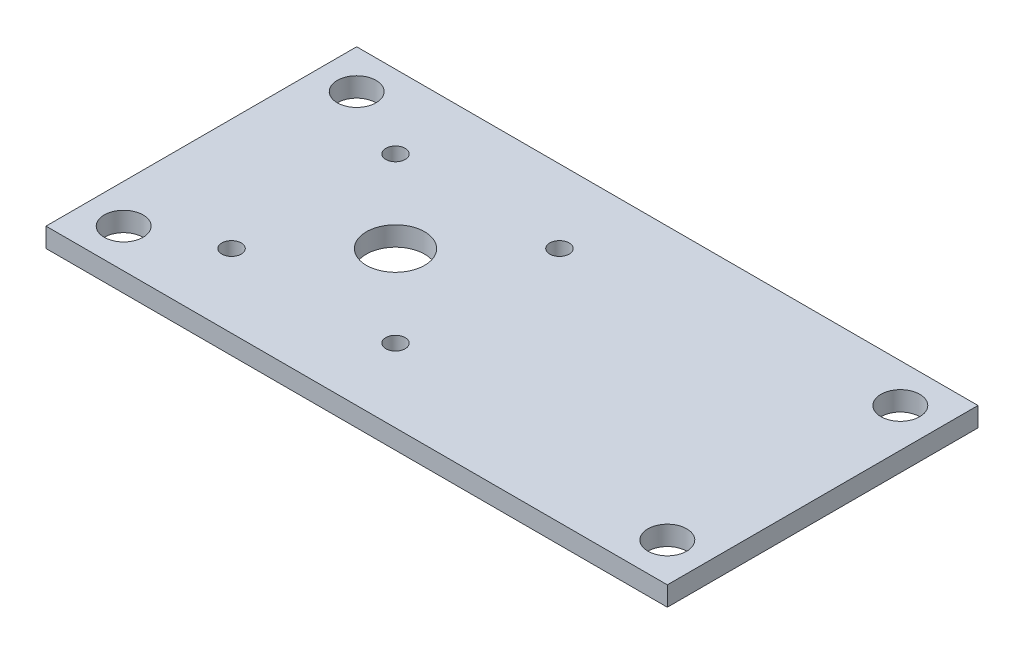
ISO-10303-21;
HEADER;
FILE_DESCRIPTION(('STEP AP214'),'2;1');
FILE_NAME('part.step','',(''),(''),'','','');
FILE_SCHEMA(('AUTOMOTIVE_DESIGN { 1 0 10303 214 1 1 1 1 }'));
ENDSEC;
DATA;
#1=APPLICATION_CONTEXT('core data for automotive mechanical design processes');
#2=APPLICATION_PROTOCOL_DEFINITION('international standard','automotive_design',2000,#1);
#3=PRODUCT_CONTEXT('',#1,'mechanical');
#4=PRODUCT('Part','Part','',(#3));
#5=PRODUCT_RELATED_PRODUCT_CATEGORY('part','',(#4));
#6=PRODUCT_DEFINITION_FORMATION('','',#4);
#7=PRODUCT_DEFINITION_CONTEXT('part definition',#1,'design');
#8=PRODUCT_DEFINITION('design','',#6,#7);
#9=PRODUCT_DEFINITION_SHAPE('','',#8);
#10=(LENGTH_UNIT() NAMED_UNIT(*) SI_UNIT(.MILLI.,.METRE.));
#11=(NAMED_UNIT(*) PLANE_ANGLE_UNIT() SI_UNIT($,.RADIAN.));
#12=(NAMED_UNIT(*) SI_UNIT($,.STERADIAN.) SOLID_ANGLE_UNIT());
#13=UNCERTAINTY_MEASURE_WITH_UNIT(LENGTH_MEASURE(1.E-05),#10,'distance_accuracy_value','');
#14=(GEOMETRIC_REPRESENTATION_CONTEXT(3) GLOBAL_UNCERTAINTY_ASSIGNED_CONTEXT((#13)) GLOBAL_UNIT_ASSIGNED_CONTEXT((#10,
#11,#12)) REPRESENTATION_CONTEXT('',''));
#15=CARTESIAN_POINT('',(0.,0.,0.));
#16=DIRECTION('',(0.,0.,1.));
#17=DIRECTION('',(1.,0.,0.));
#18=AXIS2_PLACEMENT_3D('',#15,#16,#17);
#19=CARTESIAN_POINT('',(0.,6.35,0.));
#20=DIRECTION('',(1.,0.,0.));
#21=DIRECTION('',(0.,0.,-1.));
#22=AXIS2_PLACEMENT_3D('',#19,#20,#21);
#23=PLANE('',#22);
#24=DIRECTION('',(0.,0.,1.));
#25=VECTOR('',#24,1.);
#26=CARTESIAN_POINT('',(0.,0.,0.));
#27=LINE('',#26,#25);
#28=CARTESIAN_POINT('',(0.,0.,-101.6));
#29=VERTEX_POINT('',#28);
#30=CARTESIAN_POINT('',(0.,0.,0.));
#31=VERTEX_POINT('',#30);
#32=EDGE_CURVE('E95',#29,#31,#27,.T.);
#33=ORIENTED_EDGE('',*,*,#32,.T.);
#34=DIRECTION('',(0.,-1.,0.));
#35=VECTOR('',#34,1.);
#36=CARTESIAN_POINT('',(0.,6.35,0.));
#37=LINE('',#36,#35);
#38=CARTESIAN_POINT('',(0.,6.35,0.));
#39=VERTEX_POINT('',#38);
#40=EDGE_CURVE('E11',#39,#31,#37,.T.);
#41=ORIENTED_EDGE('',*,*,#40,.F.);
#42=DIRECTION('',(0.,0.,1.));
#43=VECTOR('',#42,1.);
#44=CARTESIAN_POINT('',(0.,6.35,0.));
#45=LINE('',#44,#43);
#46=CARTESIAN_POINT('',(0.,6.35,-101.6));
#47=VERTEX_POINT('',#46);
#48=EDGE_CURVE('E83',#47,#39,#45,.T.);
#49=ORIENTED_EDGE('',*,*,#48,.F.);
#50=DIRECTION('',(0.,-1.,0.));
#51=VECTOR('',#50,1.);
#52=CARTESIAN_POINT('',(0.,6.35,-101.6));
#53=LINE('',#52,#51);
#54=EDGE_CURVE('E91',#47,#29,#53,.T.);
#55=ORIENTED_EDGE('',*,*,#54,.T.);
#56=EDGE_LOOP('',(#33,#41,#49,#55));
#57=FACE_BOUND('',#56,.T.);
#58=ADVANCED_FACE('F32',(#57),#23,.F.);
#59=CARTESIAN_POINT('',(0.,6.35,0.));
#60=DIRECTION('',(0.,0.,-1.));
#61=DIRECTION('',(-1.,0.,0.));
#62=AXIS2_PLACEMENT_3D('',#59,#60,#61);
#63=PLANE('',#62);
#64=DIRECTION('',(1.,0.,0.));
#65=VECTOR('',#64,1.);
#66=CARTESIAN_POINT('',(0.,0.,0.));
#67=LINE('',#66,#65);
#68=CARTESIAN_POINT('',(203.2,0.,0.));
#69=VERTEX_POINT('',#68);
#70=EDGE_CURVE('E87',#31,#69,#67,.T.);
#71=ORIENTED_EDGE('',*,*,#70,.T.);
#72=DIRECTION('',(0.,-1.,0.));
#73=VECTOR('',#72,1.);
#74=CARTESIAN_POINT('',(203.2,6.35,0.));
#75=LINE('',#74,#73);
#76=CARTESIAN_POINT('',(203.2,6.35,0.));
#77=VERTEX_POINT('',#76);
#78=EDGE_CURVE('E40',#77,#69,#75,.T.);
#79=ORIENTED_EDGE('',*,*,#78,.F.);
#80=DIRECTION('',(1.,0.,0.));
#81=VECTOR('',#80,1.);
#82=CARTESIAN_POINT('',(0.,6.35,0.));
#83=LINE('',#82,#81);
#84=EDGE_CURVE('E78',#39,#77,#83,.T.);
#85=ORIENTED_EDGE('',*,*,#84,.F.);
#86=ORIENTED_EDGE('',*,*,#40,.T.);
#87=EDGE_LOOP('',(#71,#79,#85,#86));
#88=FACE_BOUND('',#87,.T.);
#89=ADVANCED_FACE('F86',(#88),#63,.F.);
#90=CARTESIAN_POINT('',(203.2,6.35,0.));
#91=DIRECTION('',(-1.,0.,0.));
#92=DIRECTION('',(0.,0.,1.));
#93=AXIS2_PLACEMENT_3D('',#90,#91,#92);
#94=PLANE('',#93);
#95=DIRECTION('',(0.,0.,-1.));
#96=VECTOR('',#95,1.);
#97=CARTESIAN_POINT('',(203.2,0.,0.));
#98=LINE('',#97,#96);
#99=CARTESIAN_POINT('',(203.2,0.,-101.6));
#100=VERTEX_POINT('',#99);
#101=EDGE_CURVE('E65',#69,#100,#98,.T.);
#102=ORIENTED_EDGE('',*,*,#101,.T.);
#103=DIRECTION('',(0.,-1.,0.));
#104=VECTOR('',#103,1.);
#105=CARTESIAN_POINT('',(203.2,6.35,-101.6));
#106=LINE('',#105,#104);
#107=CARTESIAN_POINT('',(203.2,6.35,-101.6));
#108=VERTEX_POINT('',#107);
#109=EDGE_CURVE('E88',#108,#100,#106,.T.);
#110=ORIENTED_EDGE('',*,*,#109,.F.);
#111=DIRECTION('',(0.,0.,-1.));
#112=VECTOR('',#111,1.);
#113=CARTESIAN_POINT('',(203.2,6.35,0.));
#114=LINE('',#113,#112);
#115=EDGE_CURVE('E81',#77,#108,#114,.T.);
#116=ORIENTED_EDGE('',*,*,#115,.F.);
#117=ORIENTED_EDGE('',*,*,#78,.T.);
#118=EDGE_LOOP('',(#102,#110,#116,#117));
#119=FACE_BOUND('',#118,.T.);
#120=ADVANCED_FACE('F89',(#119),#94,.F.);
#121=CARTESIAN_POINT('',(0.,6.35,-101.6));
#122=DIRECTION('',(0.,0.,1.));
#123=DIRECTION('',(1.,0.,0.));
#124=AXIS2_PLACEMENT_3D('',#121,#122,#123);
#125=PLANE('',#124);
#126=DIRECTION('',(-1.,0.,0.));
#127=VECTOR('',#126,1.);
#128=CARTESIAN_POINT('',(0.,0.,-101.6));
#129=LINE('',#128,#127);
#130=EDGE_CURVE('E71',#100,#29,#129,.T.);
#131=ORIENTED_EDGE('',*,*,#130,.T.);
#132=ORIENTED_EDGE('',*,*,#54,.F.);
#133=DIRECTION('',(-1.,0.,0.));
#134=VECTOR('',#133,1.);
#135=CARTESIAN_POINT('',(0.,6.35,-101.6));
#136=LINE('',#135,#134);
#137=EDGE_CURVE('E48',#108,#47,#136,.T.);
#138=ORIENTED_EDGE('',*,*,#137,.F.);
#139=ORIENTED_EDGE('',*,*,#109,.T.);
#140=EDGE_LOOP('',(#131,#132,#138,#139));
#141=FACE_BOUND('',#140,.T.);
#142=ADVANCED_FACE('F103',(#141),#125,.F.);
#143=CARTESIAN_POINT('',(0.,6.35,0.));
#144=DIRECTION('',(0.,-1.,0.));
#145=DIRECTION('',(0.,0.,-1.));
#146=AXIS2_PLACEMENT_3D('',#143,#144,#145);
#147=PLANE('',#146);
#148=CARTESIAN_POINT('',(90.306064521391,6.35,-77.6060645213918));
#149=DIRECTION('',(0.,1.,0.));
#150=DIRECTION('',(-1.,0.,0.));
#151=AXIS2_PLACEMENT_3D('',#148,#149,#150);
#152=CIRCLE('',#151,3.17499999999999);
#153=CARTESIAN_POINT('',(87.131064521391,6.35,-77.6060645213918));
#154=VERTEX_POINT('',#153);
#155=EDGE_CURVE('E157',#154,#154,#152,.T.);
#156=ORIENTED_EDGE('',*,*,#155,.F.);
#157=EDGE_LOOP('',(#156));
#158=FACE_BOUND('',#157,.T.);
#159=CARTESIAN_POINT('',(90.3060645213916,6.35,-23.9939354786087));
#160=DIRECTION('',(0.,1.,0.));
#161=DIRECTION('',(0.,0.,-1.));
#162=AXIS2_PLACEMENT_3D('',#159,#160,#161);
#163=CIRCLE('',#162,3.17499999999999);
#164=CARTESIAN_POINT('',(90.3060645213916,6.35,-27.1689354786087));
#165=VERTEX_POINT('',#164);
#166=EDGE_CURVE('E151',#165,#165,#163,.T.);
#167=ORIENTED_EDGE('',*,*,#166,.F.);
#168=EDGE_LOOP('',(#167));
#169=FACE_BOUND('',#168,.T.);
#170=CARTESIAN_POINT('',(36.6939354786088,6.35,-23.9939354786083));
#171=DIRECTION('',(0.,1.,0.));
#172=DIRECTION('',(1.,0.,0.));
#173=AXIS2_PLACEMENT_3D('',#170,#171,#172);
#174=CIRCLE('',#173,3.17499999999999);
#175=CARTESIAN_POINT('',(39.8689354786088,6.35,-23.9939354786083));
#176=VERTEX_POINT('',#175);
#177=EDGE_CURVE('E145',#176,#176,#174,.T.);
#178=ORIENTED_EDGE('',*,*,#177,.F.);
#179=EDGE_LOOP('',(#178));
#180=FACE_BOUND('',#179,.T.);
#181=CARTESIAN_POINT('',(36.6939354786084,6.35,-77.6060645213913));
#182=DIRECTION('',(0.,1.,0.));
#183=DIRECTION('',(0.,0.,1.));
#184=AXIS2_PLACEMENT_3D('',#181,#182,#183);
#185=CIRCLE('',#184,3.17499999999999);
#186=CARTESIAN_POINT('',(36.6939354786084,6.35,-74.4310645213913));
#187=VERTEX_POINT('',#186);
#188=EDGE_CURVE('E139',#187,#187,#185,.T.);
#189=ORIENTED_EDGE('',*,*,#188,.F.);
#190=EDGE_LOOP('',(#189));
#191=FACE_BOUND('',#190,.T.);
#192=CARTESIAN_POINT('',(190.5,6.35,-88.9));
#193=DIRECTION('',(0.,-1.,0.));
#194=DIRECTION('',(0.,0.,1.));
#195=AXIS2_PLACEMENT_3D('',#192,#193,#194);
#196=CIRCLE('',#195,6.35);
#197=CARTESIAN_POINT('',(190.5,6.35,-82.55));
#198=VERTEX_POINT('',#197);
#199=EDGE_CURVE('E133',#198,#198,#196,.T.);
#200=ORIENTED_EDGE('',*,*,#199,.T.);
#201=EDGE_LOOP('',(#200));
#202=FACE_BOUND('',#201,.T.);
#203=CARTESIAN_POINT('',(190.5,6.35,-12.7));
#204=DIRECTION('',(0.,1.,0.));
#205=DIRECTION('',(0.,0.,-1.));
#206=AXIS2_PLACEMENT_3D('',#203,#204,#205);
#207=CIRCLE('',#206,6.35);
#208=CARTESIAN_POINT('',(190.5,6.35,-19.05));
#209=VERTEX_POINT('',#208);
#210=EDGE_CURVE('E127',#209,#209,#207,.T.);
#211=ORIENTED_EDGE('',*,*,#210,.F.);
#212=EDGE_LOOP('',(#211));
#213=FACE_BOUND('',#212,.T.);
#214=CARTESIAN_POINT('',(12.7,6.35,-12.7));
#215=DIRECTION('',(0.,-1.,0.));
#216=DIRECTION('',(0.,0.,-1.));
#217=AXIS2_PLACEMENT_3D('',#214,#215,#216);
#218=CIRCLE('',#217,6.35);
#219=CARTESIAN_POINT('',(12.7,6.35,-19.05));
#220=VERTEX_POINT('',#219);
#221=EDGE_CURVE('E121',#220,#220,#218,.T.);
#222=ORIENTED_EDGE('',*,*,#221,.T.);
#223=EDGE_LOOP('',(#222));
#224=FACE_BOUND('',#223,.T.);
#225=CARTESIAN_POINT('',(12.7,6.35,-88.9));
#226=DIRECTION('',(0.,1.,0.));
#227=DIRECTION('',(0.,0.,1.));
#228=AXIS2_PLACEMENT_3D('',#225,#226,#227);
#229=CIRCLE('',#228,6.35);
#230=CARTESIAN_POINT('',(12.7,6.35,-82.55));
#231=VERTEX_POINT('',#230);
#232=EDGE_CURVE('E115',#231,#231,#229,.T.);
#233=ORIENTED_EDGE('',*,*,#232,.F.);
#234=EDGE_LOOP('',(#233));
#235=FACE_BOUND('',#234,.T.);
#236=CARTESIAN_POINT('',(63.5,6.35,-50.8));
#237=DIRECTION('',(0.,1.,0.));
#238=DIRECTION('',(0.,0.,1.));
#239=AXIS2_PLACEMENT_3D('',#236,#237,#238);
#240=CIRCLE('',#239,9.52500000000002);
#241=CARTESIAN_POINT('',(63.5,6.35,-41.275));
#242=VERTEX_POINT('',#241);
#243=EDGE_CURVE('E109',#242,#242,#240,.T.);
#244=ORIENTED_EDGE('',*,*,#243,.F.);
#245=EDGE_LOOP('',(#244));
#246=FACE_BOUND('',#245,.T.);
#247=ORIENTED_EDGE('',*,*,#48,.T.);
#248=ORIENTED_EDGE('',*,*,#84,.T.);
#249=ORIENTED_EDGE('',*,*,#115,.T.);
#250=ORIENTED_EDGE('',*,*,#137,.T.);
#251=EDGE_LOOP('',(#247,#248,#249,#250));
#252=FACE_BOUND('',#251,.T.);
#253=ADVANCED_FACE('F79',(#158,#169,#180,#191,#202,#213,#224,#235,#246,#252),#147,.F.);
#254=CARTESIAN_POINT('',(0.,0.,0.));
#255=DIRECTION('',(0.,-1.,0.));
#256=DIRECTION('',(0.,0.,-1.));
#257=AXIS2_PLACEMENT_3D('',#254,#255,#256);
#258=PLANE('',#257);
#259=CARTESIAN_POINT('',(90.306064521391,0.,-77.6060645213918));
#260=DIRECTION('',(0.,1.,0.));
#261=DIRECTION('',(-1.,0.,0.));
#262=AXIS2_PLACEMENT_3D('',#259,#260,#261);
#263=CIRCLE('',#262,3.17499999999999);
#264=CARTESIAN_POINT('',(87.131064521391,0.,-77.6060645213918));
#265=VERTEX_POINT('',#264);
#266=EDGE_CURVE('E154',#265,#265,#263,.T.);
#267=ORIENTED_EDGE('',*,*,#266,.T.);
#268=EDGE_LOOP('',(#267));
#269=FACE_BOUND('',#268,.T.);
#270=CARTESIAN_POINT('',(90.3060645213916,0.,-23.9939354786087));
#271=DIRECTION('',(0.,1.,0.));
#272=DIRECTION('',(0.,0.,-1.));
#273=AXIS2_PLACEMENT_3D('',#270,#271,#272);
#274=CIRCLE('',#273,3.17499999999999);
#275=CARTESIAN_POINT('',(90.3060645213916,0.,-27.1689354786087));
#276=VERTEX_POINT('',#275);
#277=EDGE_CURVE('E148',#276,#276,#274,.T.);
#278=ORIENTED_EDGE('',*,*,#277,.T.);
#279=EDGE_LOOP('',(#278));
#280=FACE_BOUND('',#279,.T.);
#281=CARTESIAN_POINT('',(36.6939354786088,0.,-23.9939354786083));
#282=DIRECTION('',(0.,1.,0.));
#283=DIRECTION('',(1.,0.,0.));
#284=AXIS2_PLACEMENT_3D('',#281,#282,#283);
#285=CIRCLE('',#284,3.17499999999999);
#286=CARTESIAN_POINT('',(39.8689354786088,0.,-23.9939354786083));
#287=VERTEX_POINT('',#286);
#288=EDGE_CURVE('E142',#287,#287,#285,.T.);
#289=ORIENTED_EDGE('',*,*,#288,.T.);
#290=EDGE_LOOP('',(#289));
#291=FACE_BOUND('',#290,.T.);
#292=CARTESIAN_POINT('',(36.6939354786084,0.,-77.6060645213913));
#293=DIRECTION('',(0.,1.,0.));
#294=DIRECTION('',(0.,0.,1.));
#295=AXIS2_PLACEMENT_3D('',#292,#293,#294);
#296=CIRCLE('',#295,3.17499999999999);
#297=CARTESIAN_POINT('',(36.6939354786084,0.,-74.4310645213913));
#298=VERTEX_POINT('',#297);
#299=EDGE_CURVE('E136',#298,#298,#296,.T.);
#300=ORIENTED_EDGE('',*,*,#299,.T.);
#301=EDGE_LOOP('',(#300));
#302=FACE_BOUND('',#301,.T.);
#303=CARTESIAN_POINT('',(190.5,0.,-88.9));
#304=DIRECTION('',(0.,-1.,0.));
#305=DIRECTION('',(0.,0.,1.));
#306=AXIS2_PLACEMENT_3D('',#303,#304,#305);
#307=CIRCLE('',#306,6.35);
#308=CARTESIAN_POINT('',(190.5,0.,-82.55));
#309=VERTEX_POINT('',#308);
#310=EDGE_CURVE('E130',#309,#309,#307,.T.);
#311=ORIENTED_EDGE('',*,*,#310,.F.);
#312=EDGE_LOOP('',(#311));
#313=FACE_BOUND('',#312,.T.);
#314=CARTESIAN_POINT('',(190.5,0.,-12.7));
#315=DIRECTION('',(0.,1.,0.));
#316=DIRECTION('',(0.,0.,-1.));
#317=AXIS2_PLACEMENT_3D('',#314,#315,#316);
#318=CIRCLE('',#317,6.35);
#319=CARTESIAN_POINT('',(190.5,0.,-19.05));
#320=VERTEX_POINT('',#319);
#321=EDGE_CURVE('E124',#320,#320,#318,.T.);
#322=ORIENTED_EDGE('',*,*,#321,.T.);
#323=EDGE_LOOP('',(#322));
#324=FACE_BOUND('',#323,.T.);
#325=CARTESIAN_POINT('',(12.7,0.,-12.7));
#326=DIRECTION('',(0.,-1.,0.));
#327=DIRECTION('',(0.,0.,-1.));
#328=AXIS2_PLACEMENT_3D('',#325,#326,#327);
#329=CIRCLE('',#328,6.35);
#330=CARTESIAN_POINT('',(12.7,0.,-19.05));
#331=VERTEX_POINT('',#330);
#332=EDGE_CURVE('E118',#331,#331,#329,.T.);
#333=ORIENTED_EDGE('',*,*,#332,.F.);
#334=EDGE_LOOP('',(#333));
#335=FACE_BOUND('',#334,.T.);
#336=CARTESIAN_POINT('',(12.7,0.,-88.9));
#337=DIRECTION('',(0.,1.,0.));
#338=DIRECTION('',(0.,0.,1.));
#339=AXIS2_PLACEMENT_3D('',#336,#337,#338);
#340=CIRCLE('',#339,6.35);
#341=CARTESIAN_POINT('',(12.7,0.,-82.55));
#342=VERTEX_POINT('',#341);
#343=EDGE_CURVE('E112',#342,#342,#340,.T.);
#344=ORIENTED_EDGE('',*,*,#343,.T.);
#345=EDGE_LOOP('',(#344));
#346=FACE_BOUND('',#345,.T.);
#347=CARTESIAN_POINT('',(63.5,0.,-50.8));
#348=DIRECTION('',(0.,1.,0.));
#349=DIRECTION('',(0.,0.,1.));
#350=AXIS2_PLACEMENT_3D('',#347,#348,#349);
#351=CIRCLE('',#350,9.52500000000002);
#352=CARTESIAN_POINT('',(63.5,0.,-41.275));
#353=VERTEX_POINT('',#352);
#354=EDGE_CURVE('E98',#353,#353,#351,.T.);
#355=ORIENTED_EDGE('',*,*,#354,.T.);
#356=EDGE_LOOP('',(#355));
#357=FACE_BOUND('',#356,.T.);
#358=ORIENTED_EDGE('',*,*,#32,.F.);
#359=ORIENTED_EDGE('',*,*,#130,.F.);
#360=ORIENTED_EDGE('',*,*,#101,.F.);
#361=ORIENTED_EDGE('',*,*,#70,.F.);
#362=EDGE_LOOP('',(#358,#359,#360,#361));
#363=FACE_BOUND('',#362,.T.);
#364=ADVANCED_FACE('F106',(#269,#280,#291,#302,#313,#324,#335,#346,#357,#363),#258,.T.);
#365=CARTESIAN_POINT('',(63.5,0.,-50.8));
#366=DIRECTION('',(0.,1.,0.));
#367=DIRECTION('',(0.,0.,1.));
#368=AXIS2_PLACEMENT_3D('',#365,#366,#367);
#369=CYLINDRICAL_SURFACE('',#368,9.52500000000002);
#370=ORIENTED_EDGE('',*,*,#354,.F.);
#371=EDGE_LOOP('',(#370));
#372=FACE_BOUND('',#371,.T.);
#373=ORIENTED_EDGE('',*,*,#243,.T.);
#374=EDGE_LOOP('',(#373));
#375=FACE_BOUND('',#374,.T.);
#376=ADVANCED_FACE('F191',(#372,#375),#369,.F.);
#377=CARTESIAN_POINT('',(12.7,0.,-88.9));
#378=DIRECTION('',(0.,1.,0.));
#379=DIRECTION('',(0.,0.,1.));
#380=AXIS2_PLACEMENT_3D('',#377,#378,#379);
#381=CYLINDRICAL_SURFACE('',#380,6.35);
#382=ORIENTED_EDGE('',*,*,#343,.F.);
#383=EDGE_LOOP('',(#382));
#384=FACE_BOUND('',#383,.T.);
#385=ORIENTED_EDGE('',*,*,#232,.T.);
#386=EDGE_LOOP('',(#385));
#387=FACE_BOUND('',#386,.T.);
#388=ADVANCED_FACE('F193',(#384,#387),#381,.F.);
#389=CARTESIAN_POINT('',(12.7,0.,-12.7));
#390=DIRECTION('',(0.,1.,0.));
#391=DIRECTION('',(0.,0.,1.));
#392=AXIS2_PLACEMENT_3D('',#389,#390,#391);
#393=CYLINDRICAL_SURFACE('',#392,6.35);
#394=ORIENTED_EDGE('',*,*,#332,.T.);
#395=EDGE_LOOP('',(#394));
#396=FACE_BOUND('',#395,.T.);
#397=ORIENTED_EDGE('',*,*,#221,.F.);
#398=EDGE_LOOP('',(#397));
#399=FACE_BOUND('',#398,.T.);
#400=ADVANCED_FACE('F200',(#396,#399),#393,.F.);
#401=CARTESIAN_POINT('',(190.5,0.,-12.7));
#402=DIRECTION('',(0.,1.,0.));
#403=DIRECTION('',(0.,0.,1.));
#404=AXIS2_PLACEMENT_3D('',#401,#402,#403);
#405=CYLINDRICAL_SURFACE('',#404,6.35);
#406=ORIENTED_EDGE('',*,*,#321,.F.);
#407=EDGE_LOOP('',(#406));
#408=FACE_BOUND('',#407,.T.);
#409=ORIENTED_EDGE('',*,*,#210,.T.);
#410=EDGE_LOOP('',(#409));
#411=FACE_BOUND('',#410,.T.);
#412=ADVANCED_FACE('F269',(#408,#411),#405,.F.);
#413=CARTESIAN_POINT('',(190.5,0.,-88.9));
#414=DIRECTION('',(0.,1.,0.));
#415=DIRECTION('',(0.,0.,1.));
#416=AXIS2_PLACEMENT_3D('',#413,#414,#415);
#417=CYLINDRICAL_SURFACE('',#416,6.35);
#418=ORIENTED_EDGE('',*,*,#310,.T.);
#419=EDGE_LOOP('',(#418));
#420=FACE_BOUND('',#419,.T.);
#421=ORIENTED_EDGE('',*,*,#199,.F.);
#422=EDGE_LOOP('',(#421));
#423=FACE_BOUND('',#422,.T.);
#424=ADVANCED_FACE('F265',(#420,#423),#417,.F.);
#425=CARTESIAN_POINT('',(36.6939354786084,0.,-77.6060645213913));
#426=DIRECTION('',(0.,1.,0.));
#427=DIRECTION('',(0.,0.,1.));
#428=AXIS2_PLACEMENT_3D('',#425,#426,#427);
#429=CYLINDRICAL_SURFACE('',#428,3.17499999999999);
#430=ORIENTED_EDGE('',*,*,#299,.F.);
#431=EDGE_LOOP('',(#430));
#432=FACE_BOUND('',#431,.T.);
#433=ORIENTED_EDGE('',*,*,#188,.T.);
#434=EDGE_LOOP('',(#433));
#435=FACE_BOUND('',#434,.T.);
#436=ADVANCED_FACE('F239',(#432,#435),#429,.F.);
#437=CARTESIAN_POINT('',(36.6939354786088,0.,-23.9939354786083));
#438=DIRECTION('',(0.,1.,0.));
#439=DIRECTION('',(0.,0.,1.));
#440=AXIS2_PLACEMENT_3D('',#437,#438,#439);
#441=CYLINDRICAL_SURFACE('',#440,3.17499999999999);
#442=ORIENTED_EDGE('',*,*,#288,.F.);
#443=EDGE_LOOP('',(#442));
#444=FACE_BOUND('',#443,.T.);
#445=ORIENTED_EDGE('',*,*,#177,.T.);
#446=EDGE_LOOP('',(#445));
#447=FACE_BOUND('',#446,.T.);
#448=ADVANCED_FACE('F234',(#444,#447),#441,.F.);
#449=CARTESIAN_POINT('',(90.3060645213916,0.,-23.9939354786087));
#450=DIRECTION('',(0.,1.,0.));
#451=DIRECTION('',(0.,0.,1.));
#452=AXIS2_PLACEMENT_3D('',#449,#450,#451);
#453=CYLINDRICAL_SURFACE('',#452,3.17499999999999);
#454=ORIENTED_EDGE('',*,*,#277,.F.);
#455=EDGE_LOOP('',(#454));
#456=FACE_BOUND('',#455,.T.);
#457=ORIENTED_EDGE('',*,*,#166,.T.);
#458=EDGE_LOOP('',(#457));
#459=FACE_BOUND('',#458,.T.);
#460=ADVANCED_FACE('F168',(#456,#459),#453,.F.);
#461=CARTESIAN_POINT('',(90.306064521391,0.,-77.6060645213918));
#462=DIRECTION('',(0.,1.,0.));
#463=DIRECTION('',(0.,0.,1.));
#464=AXIS2_PLACEMENT_3D('',#461,#462,#463);
#465=CYLINDRICAL_SURFACE('',#464,3.17499999999999);
#466=ORIENTED_EDGE('',*,*,#266,.F.);
#467=EDGE_LOOP('',(#466));
#468=FACE_BOUND('',#467,.T.);
#469=ORIENTED_EDGE('',*,*,#155,.T.);
#470=EDGE_LOOP('',(#469));
#471=FACE_BOUND('',#470,.T.);
#472=ADVANCED_FACE('F165',(#468,#471),#465,.F.);
#473=CLOSED_SHELL('',(#58,#89,#120,#142,#253,#364,#376,#388,#400,#412,#424,#436,#448,#460,#472));
#474=MANIFOLD_SOLID_BREP('B2',#473);
#475=ADVANCED_BREP_SHAPE_REPRESENTATION('',(#18,#474),#14);
#476=SHAPE_DEFINITION_REPRESENTATION(#9,#475);
ENDSEC;
END-ISO-10303-21;
